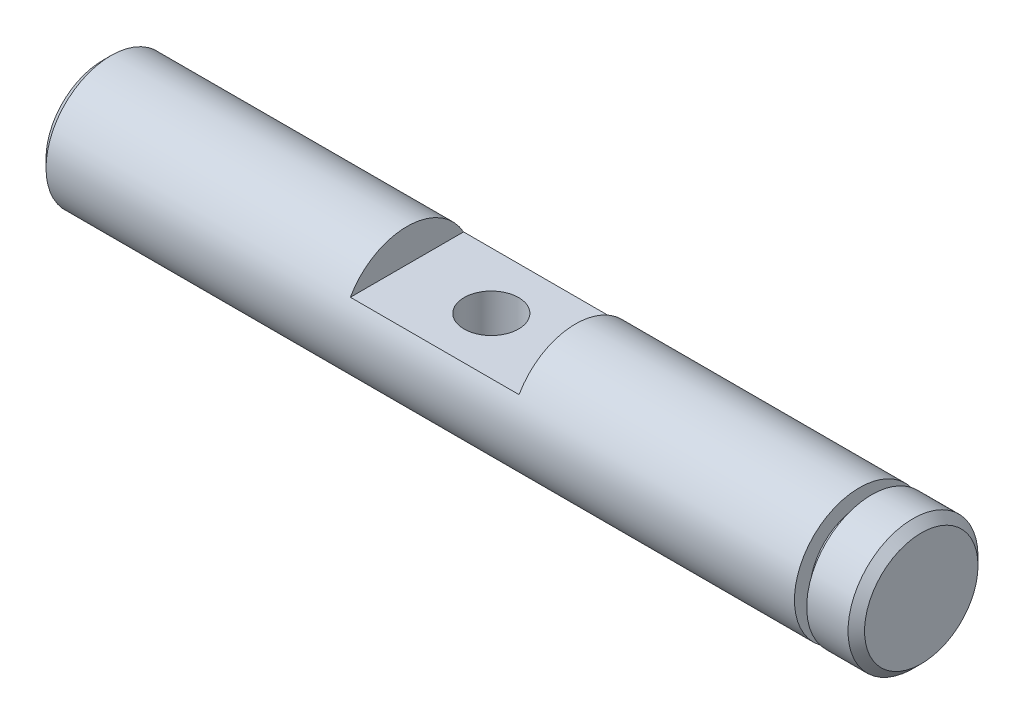
ISO-10303-21;
HEADER;
FILE_DESCRIPTION(('STEP AP214'),'2;1');
FILE_NAME('part.step','',(''),(''),'','','');
FILE_SCHEMA(('AUTOMOTIVE_DESIGN { 1 0 10303 214 1 1 1 1 }'));
ENDSEC;
DATA;
#1=APPLICATION_CONTEXT('core data for automotive mechanical design processes');
#2=APPLICATION_PROTOCOL_DEFINITION('international standard','automotive_design',2000,#1);
#3=PRODUCT_CONTEXT('',#1,'mechanical');
#4=PRODUCT('Part','Part','',(#3));
#5=PRODUCT_RELATED_PRODUCT_CATEGORY('part','',(#4));
#6=PRODUCT_DEFINITION_FORMATION('','',#4);
#7=PRODUCT_DEFINITION_CONTEXT('part definition',#1,'design');
#8=PRODUCT_DEFINITION('design','',#6,#7);
#9=PRODUCT_DEFINITION_SHAPE('','',#8);
#10=(LENGTH_UNIT() NAMED_UNIT(*) SI_UNIT(.MILLI.,.METRE.));
#11=(NAMED_UNIT(*) PLANE_ANGLE_UNIT() SI_UNIT($,.RADIAN.));
#12=(NAMED_UNIT(*) SI_UNIT($,.STERADIAN.) SOLID_ANGLE_UNIT());
#13=UNCERTAINTY_MEASURE_WITH_UNIT(LENGTH_MEASURE(1.E-05),#10,'distance_accuracy_value','');
#14=(GEOMETRIC_REPRESENTATION_CONTEXT(3) GLOBAL_UNCERTAINTY_ASSIGNED_CONTEXT((#13)) GLOBAL_UNIT_ASSIGNED_CONTEXT((#10,
#11,#12)) REPRESENTATION_CONTEXT('',''));
#15=CARTESIAN_POINT('',(0.,0.,0.));
#16=DIRECTION('',(0.,0.,1.));
#17=DIRECTION('',(1.,0.,0.));
#18=AXIS2_PLACEMENT_3D('',#15,#16,#17);
#19=CARTESIAN_POINT('',(-20.9,1.93,-3.42344855372474));
#20=DIRECTION('',(0.,-1.,0.));
#21=DIRECTION('',(0.,0.,-1.));
#22=AXIS2_PLACEMENT_3D('',#19,#20,#21);
#23=PLANE('',#22);
#24=DIRECTION('',(0.,0.,1.));
#25=VECTOR('',#24,1.);
#26=CARTESIAN_POINT('',(-31.1,1.93,-3.42344855372474));
#27=LINE('',#26,#25);
#28=CARTESIAN_POINT('',(-31.1,1.93,-3.42344855372474));
#29=VERTEX_POINT('',#28);
#30=CARTESIAN_POINT('',(-31.1,1.93,3.42344855372474));
#31=VERTEX_POINT('',#30);
#32=EDGE_CURVE('E72',#29,#31,#27,.T.);
#33=ORIENTED_EDGE('',*,*,#32,.T.);
#34=DIRECTION('',(-1.,0.,0.));
#35=VECTOR('',#34,1.);
#36=CARTESIAN_POINT('',(-20.9,1.93,3.42344855372474));
#37=LINE('',#36,#35);
#38=CARTESIAN_POINT('',(-20.9,1.93,3.42344855372474));
#39=VERTEX_POINT('',#38);
#40=EDGE_CURVE('E80',#39,#31,#37,.T.);
#41=ORIENTED_EDGE('',*,*,#40,.F.);
#42=DIRECTION('',(0.,0.,1.));
#43=VECTOR('',#42,1.);
#44=CARTESIAN_POINT('',(-20.9,1.93,-3.42344855372474));
#45=LINE('',#44,#43);
#46=CARTESIAN_POINT('',(-20.9,1.93,-3.42344855372474));
#47=VERTEX_POINT('',#46);
#48=EDGE_CURVE('E108',#47,#39,#45,.T.);
#49=ORIENTED_EDGE('',*,*,#48,.F.);
#50=DIRECTION('',(-1.,0.,0.));
#51=VECTOR('',#50,1.);
#52=CARTESIAN_POINT('',(-20.9,1.93,-3.42344855372474));
#53=LINE('',#52,#51);
#54=EDGE_CURVE('E94',#47,#29,#53,.T.);
#55=ORIENTED_EDGE('',*,*,#54,.T.);
#56=EDGE_LOOP('',(#33,#41,#49,#55));
#57=FACE_BOUND('',#56,.T.);
#58=CARTESIAN_POINT('',(-26.,1.93,0.));
#59=DIRECTION('',(0.,1.,0.));
#60=DIRECTION('',(0.,0.,1.));
#61=AXIS2_PLACEMENT_3D('',#58,#59,#60);
#62=CIRCLE('',#61,1.65);
#63=CARTESIAN_POINT('',(-26.,1.93,1.65));
#64=VERTEX_POINT('',#63);
#65=EDGE_CURVE('E91',#64,#64,#62,.T.);
#66=ORIENTED_EDGE('',*,*,#65,.F.);
#67=EDGE_LOOP('',(#66));
#68=FACE_BOUND('',#67,.T.);
#69=ADVANCED_FACE('F51',(#57,#68),#23,.F.);
#70=CARTESIAN_POINT('',(0.,0.,0.));
#71=DIRECTION('',(1.,0.,0.));
#72=DIRECTION('',(0.,0.,-1.));
#73=AXIS2_PLACEMENT_3D('',#70,#71,#72);
#74=CYLINDRICAL_SURFACE('',#73,3.93);
#75=CARTESIAN_POINT('',(-24.35,-3.93,0.));
#76=CARTESIAN_POINT('',(-24.3500097101932,-3.9299926789985,0.0883269978215212));
#77=CARTESIAN_POINT('',(-24.3571343884214,-3.92698785604896,0.176789915546049));
#78=CARTESIAN_POINT('',(-24.3853787578915,-3.91525803732159,0.351205886288125));
#79=CARTESIAN_POINT('',(-24.4065346601639,-3.90651824165485,0.437151842841555));
#80=CARTESIAN_POINT('',(-24.4619197374349,-3.88425693415309,0.603723872787699));
#81=CARTESIAN_POINT('',(-24.4961043490442,-3.8707517334591,0.684366993554734));
#82=CARTESIAN_POINT('',(-24.576391122907,-3.84027172391907,0.838694802432977));
#83=CARTESIAN_POINT('',(-24.6224897767889,-3.82329793678784,0.912381530312186));
#84=CARTESIAN_POINT('',(-24.7277692568294,-3.78661154798099,1.05456760218472));
#85=CARTESIAN_POINT('',(-24.7874581855707,-3.76680836449226,1.1226671446446));
#86=CARTESIAN_POINT('',(-24.9171491312657,-3.72708432042744,1.24823404181553));
#87=CARTESIAN_POINT('',(-24.9871566199691,-3.7071634028323,1.30569571875639));
#88=CARTESIAN_POINT('',(-25.1397506665203,-3.66834093740185,1.41120395193725));
#89=CARTESIAN_POINT('',(-25.2227919089502,-3.64954056620032,1.4586340554539));
#90=CARTESIAN_POINT('',(-25.3965769421471,-3.61652730746775,1.53867434421455));
#91=CARTESIAN_POINT('',(-25.4873166753707,-3.60231202207438,1.5712922794308));
#92=CARTESIAN_POINT('',(-25.6693207401283,-3.58106037708631,1.61912491660325));
#93=CARTESIAN_POINT('',(-25.7603443567938,-3.57370814255634,1.63510973623413));
#94=CARTESIAN_POINT('',(-25.9440558589965,-3.56610832640151,1.65162432352032));
#95=CARTESIAN_POINT('',(-26.0367427768981,-3.56585673995529,1.65216280303577));
#96=CARTESIAN_POINT('',(-26.2134239906545,-3.57221973457656,1.63834882101229));
#97=CARTESIAN_POINT('',(-26.297532052281,-3.57829986945526,1.62515547854183));
#98=CARTESIAN_POINT('',(-26.4622068151594,-3.59573687169694,1.58619888596701));
#99=CARTESIAN_POINT('',(-26.5427728225678,-3.60709476790936,1.56043318495171));
#100=CARTESIAN_POINT('',(-26.7001271330675,-3.63406515923432,1.49655930938434));
#101=CARTESIAN_POINT('',(-26.776797464085,-3.64976362286058,1.45819844299294));
#102=CARTESIAN_POINT('',(-26.922913953025,-3.68362705904633,1.37040211265534));
#103=CARTESIAN_POINT('',(-26.9923572215252,-3.7017930114824,1.32096224397827));
#104=CARTESIAN_POINT('',(-27.1283291596033,-3.74044328708086,1.20742501261697));
#105=CARTESIAN_POINT('',(-27.1940945826481,-3.76099268954806,1.14243318194895));
#106=CARTESIAN_POINT('',(-27.3140511528564,-3.80077926076808,1.00214252669914));
#107=CARTESIAN_POINT('',(-27.3682395057146,-3.82001611195542,0.92684122094581));
#108=CARTESIAN_POINT('',(-27.4646464834446,-3.85558430243719,0.765719425568003));
#109=CARTESIAN_POINT('',(-27.5065500990819,-3.87183574234339,0.679691502376429));
#110=CARTESIAN_POINT('',(-27.5750215903072,-3.89898687097859,0.500950669168409));
#111=CARTESIAN_POINT('',(-27.6015980748126,-3.90988956346815,0.408241544823623));
#112=CARTESIAN_POINT('',(-27.6370528647678,-3.92455097291784,0.225144446145694));
#113=CARTESIAN_POINT('',(-27.6469551772896,-3.92872231961856,0.134987775583984));
#114=CARTESIAN_POINT('',(-27.6518390674538,-3.93077152354498,-0.0457883680487249));
#115=CARTESIAN_POINT('',(-27.6468250126539,-3.92865122298452,-0.136407697895148));
#116=CARTESIAN_POINT('',(-27.6227475379895,-3.91862242611764,-0.310711318354062));
#117=CARTESIAN_POINT('',(-27.6044072081616,-3.91101197501458,-0.394514602822413));
#118=CARTESIAN_POINT('',(-27.5552085648342,-3.89108850075683,-0.557760655629197));
#119=CARTESIAN_POINT('',(-27.5243486758726,-3.87877488576714,-0.637202873741838));
#120=CARTESIAN_POINT('',(-27.4499799672681,-3.85014676700823,-0.792264236302527));
#121=CARTESIAN_POINT('',(-27.4061073724435,-3.8337196726585,-0.867687448585519));
#122=CARTESIAN_POINT('',(-27.3073577987871,-3.79861242424103,-1.01037186093844));
#123=CARTESIAN_POINT('',(-27.2524761954979,-3.77993132467174,-1.0776296118924));
#124=CARTESIAN_POINT('',(-27.1286128441927,-3.7406516701824,-1.20720168853093));
#125=CARTESIAN_POINT('',(-27.0588972429186,-3.72001230055169,-1.26880393872402));
#126=CARTESIAN_POINT('',(-26.9097962899649,-3.68034946321322,-1.37963820227883));
#127=CARTESIAN_POINT('',(-26.8304086225766,-3.66132638433934,-1.42886724454268));
#128=CARTESIAN_POINT('',(-26.6624871349754,-3.62690637045008,-1.51413531819438));
#129=CARTESIAN_POINT('',(-26.5738326651811,-3.61156892904637,-1.54996255344417));
#130=CARTESIAN_POINT('',(-26.3909017963839,-3.58706375522705,-1.60587132157007));
#131=CARTESIAN_POINT('',(-26.2966302012383,-3.57789083097617,-1.62596610687657));
#132=CARTESIAN_POINT('',(-26.113054925141,-3.56755440896531,-1.64851303555964));
#133=CARTESIAN_POINT('',(-26.0239364268509,-3.56582257121674,-1.6522177533318));
#134=CARTESIAN_POINT('',(-25.8463980757674,-3.56905045777433,-1.64523381719311));
#135=CARTESIAN_POINT('',(-25.7579781139573,-3.57400911631949,-1.6345474557063));
#136=CARTESIAN_POINT('',(-25.5887226906317,-3.58953642652886,-1.6001422245184));
#137=CARTESIAN_POINT('',(-25.5077268801888,-3.59982445809366,-1.57707334181445));
#138=CARTESIAN_POINT('',(-25.3507396722111,-3.62462698186077,-1.51919883462504));
#139=CARTESIAN_POINT('',(-25.2747496925365,-3.63914266525289,-1.48438990180726));
#140=CARTESIAN_POINT('',(-25.1248999668214,-3.67185602056917,-1.40159421388986));
#141=CARTESIAN_POINT('',(-25.0514488097631,-3.69022358777055,-1.35293637075636));
#142=CARTESIAN_POINT('',(-24.9133622528258,-3.72810466091352,-1.24475606537435));
#143=CARTESIAN_POINT('',(-24.8487299987934,-3.74761857224232,-1.18522974377432));
#144=CARTESIAN_POINT('',(-24.7251645738068,-3.78733792055977,-1.05174467300407));
#145=CARTESIAN_POINT('',(-24.6670135834902,-3.80748673187844,-0.977041503100169));
#146=CARTESIAN_POINT('',(-24.5640281644525,-3.84475018287915,-0.818193911428492));
#147=CARTESIAN_POINT('',(-24.5191997907634,-3.86186344150453,-0.734045220603839));
#148=CARTESIAN_POINT('',(-24.4450824205554,-3.89088976229158,-0.559948483167666));
#149=CARTESIAN_POINT('',(-24.4155556136396,-3.90288186312324,-0.470115163768419));
#150=CARTESIAN_POINT('',(-24.3723073743874,-3.92063552175965,-0.286308061885108));
#151=CARTESIAN_POINT('',(-24.3585365917179,-3.92641653018921,-0.192348169964576));
#152=CARTESIAN_POINT('',(-24.3509673585932,-3.92959484738707,-0.0653603659641922));
#153=CARTESIAN_POINT('',(-24.3499964062938,-3.93000270947527,-0.0326894915410315));
#154=CARTESIAN_POINT('',(-24.35,-3.93,0.));
#155=B_SPLINE_CURVE_WITH_KNOTS('',3,(#75,#76,#77,#78,#79,#80,#81,#82,#83,#84,#85,#86,#87,#88,
#89,#90,#91,#92,#93,#94,#95,#96,#97,#98,#99,#100,#101,#102,#103,#104,#105,#106,#107,#108,#109,
#110,#111,#112,#113,#114,#115,#116,#117,#118,#119,#120,#121,#122,#123,#124,#125,#126,#127,#128,
#129,#130,#131,#132,#133,#134,#135,#136,#137,#138,#139,#140,#141,#142,#143,#144,#145,#146,#147,
#148,#149,#150,#151,#152,#153,#154),.UNSPECIFIED.,.T.,.F.,(4,2,2,2,2,2,2,2,2,2,2,2,2,2,2,2,2,2,
2,2,2,2,2,2,2,2,2,2,2,2,2,2,2,2,2,2,2,2,2,4),(0.,0.264886893383162,0.530460066607243,
0.795132909216566,1.05972790127276,1.33661027141791,1.61363999917676,1.90455851513283,
2.19532464181942,2.47193168760119,2.74838272171372,3.00325373864307,3.25817446111333,
3.51855871078965,3.77904666689947,4.06191885111166,4.34485923396919,4.63452261364791,
4.92402313682995,5.19499196337771,5.4658814572412,5.72307595736119,5.98030283289553,
6.24553525267182,6.5108793204878,6.79546360656313,7.08011616286466,7.36909416064038,
7.65782847140854,7.92406727577222,8.19026367469623,8.44368633456517,8.69718046839307,
8.96604605154444,9.23500729408639,9.52398638289448,9.81309661043573,10.0975676174597,
10.3811451564272,10.4791788049622),.UNSPECIFIED.);
#156=CARTESIAN_POINT('',(-24.35,-3.93,0.));
#157=VERTEX_POINT('',#156);
#158=EDGE_CURVE('E11',#157,#157,#155,.T.);
#159=ORIENTED_EDGE('',*,*,#158,.F.);
#160=EDGE_LOOP('',(#159));
#161=FACE_BOUND('',#160,.T.);
#162=CARTESIAN_POINT('',(-49.,0.,0.));
#163=DIRECTION('',(-1.,0.,0.));
#164=DIRECTION('',(0.,0.,1.));
#165=AXIS2_PLACEMENT_3D('',#162,#163,#164);
#166=CIRCLE('',#165,3.93);
#167=CARTESIAN_POINT('',(-49.,0.,3.93));
#168=VERTEX_POINT('',#167);
#169=EDGE_CURVE('E122',#168,#168,#166,.F.);
#170=ORIENTED_EDGE('',*,*,#169,.T.);
#171=EDGE_LOOP('',(#170));
#172=FACE_BOUND('',#171,.T.);
#173=CARTESIAN_POINT('',(-3.74,0.,0.));
#174=DIRECTION('',(1.,0.,0.));
#175=DIRECTION('',(0.,0.,-1.));
#176=AXIS2_PLACEMENT_3D('',#173,#174,#175);
#177=CIRCLE('',#176,3.93);
#178=CARTESIAN_POINT('',(-3.74,0.,-3.93));
#179=VERTEX_POINT('',#178);
#180=EDGE_CURVE('E101',#179,#179,#177,.T.);
#181=ORIENTED_EDGE('',*,*,#180,.F.);
#182=EDGE_LOOP('',(#181));
#183=FACE_BOUND('',#182,.T.);
#184=ORIENTED_EDGE('',*,*,#54,.F.);
#185=CARTESIAN_POINT('',(-20.9,0.,0.));
#186=DIRECTION('',(-1.,0.,0.));
#187=DIRECTION('',(0.,0.,1.));
#188=AXIS2_PLACEMENT_3D('',#185,#186,#187);
#189=CIRCLE('',#188,3.93);
#190=EDGE_CURVE('E96',#39,#47,#189,.T.);
#191=ORIENTED_EDGE('',*,*,#190,.F.);
#192=ORIENTED_EDGE('',*,*,#40,.T.);
#193=CARTESIAN_POINT('',(-31.1,0.,0.));
#194=DIRECTION('',(-1.,0.,0.));
#195=DIRECTION('',(0.,0.,1.));
#196=AXIS2_PLACEMENT_3D('',#193,#194,#195);
#197=CIRCLE('',#196,3.93);
#198=EDGE_CURVE('E86',#31,#29,#197,.T.);
#199=ORIENTED_EDGE('',*,*,#198,.T.);
#200=EDGE_LOOP('',(#184,#191,#192,#199));
#201=FACE_BOUND('',#200,.T.);
#202=ADVANCED_FACE('F99',(#161,#172,#183,#201),#74,.T.);
#203=CARTESIAN_POINT('',(0.,0.,0.));
#204=DIRECTION('',(1.,0.,0.));
#205=DIRECTION('',(0.,0.,-1.));
#206=AXIS2_PLACEMENT_3D('',#203,#204,#205);
#207=PLANE('',#206);
#208=CARTESIAN_POINT('',(0.,0.,0.));
#209=DIRECTION('',(1.,0.,0.));
#210=DIRECTION('',(0.,0.,-1.));
#211=AXIS2_PLACEMENT_3D('',#208,#209,#210);
#212=CIRCLE('',#211,3.43);
#213=CARTESIAN_POINT('',(0.,0.,-3.43));
#214=VERTEX_POINT('',#213);
#215=EDGE_CURVE('E130',#214,#214,#212,.T.);
#216=ORIENTED_EDGE('',*,*,#215,.T.);
#217=EDGE_LOOP('',(#216));
#218=FACE_BOUND('',#217,.T.);
#219=ADVANCED_FACE('F146',(#218),#207,.T.);
#220=CARTESIAN_POINT('',(0.,0.,0.));
#221=DIRECTION('',(1.,0.,0.));
#222=DIRECTION('',(0.,0.,-1.));
#223=AXIS2_PLACEMENT_3D('',#220,#221,#222);
#224=CYLINDRICAL_SURFACE('',#223,3.93);
#225=CARTESIAN_POINT('',(-0.500000000000004,0.,0.));
#226=DIRECTION('',(1.,0.,0.));
#227=DIRECTION('',(0.,0.,-1.));
#228=AXIS2_PLACEMENT_3D('',#225,#226,#227);
#229=CIRCLE('',#228,3.93);
#230=CARTESIAN_POINT('',(-0.500000000000004,0.,-3.93));
#231=VERTEX_POINT('',#230);
#232=EDGE_CURVE('E66',#231,#231,#229,.F.);
#233=ORIENTED_EDGE('',*,*,#232,.T.);
#234=EDGE_LOOP('',(#233));
#235=FACE_BOUND('',#234,.T.);
#236=CARTESIAN_POINT('',(-3.,0.,0.));
#237=DIRECTION('',(1.,0.,0.));
#238=DIRECTION('',(0.,0.,-1.));
#239=AXIS2_PLACEMENT_3D('',#236,#237,#238);
#240=CIRCLE('',#239,3.93);
#241=CARTESIAN_POINT('',(-3.,0.,-3.93));
#242=VERTEX_POINT('',#241);
#243=EDGE_CURVE('E118',#242,#242,#240,.T.);
#244=ORIENTED_EDGE('',*,*,#243,.T.);
#245=EDGE_LOOP('',(#244));
#246=FACE_BOUND('',#245,.T.);
#247=ADVANCED_FACE('F137',(#235,#246),#224,.T.);
#248=CARTESIAN_POINT('',(-3.,3.93,0.));
#249=DIRECTION('',(-1.,0.,0.));
#250=DIRECTION('',(0.,0.,1.));
#251=AXIS2_PLACEMENT_3D('',#248,#249,#250);
#252=PLANE('',#251);
#253=CARTESIAN_POINT('',(-3.,0.,0.));
#254=DIRECTION('',(1.,0.,0.));
#255=DIRECTION('',(0.,0.,-1.));
#256=AXIS2_PLACEMENT_3D('',#253,#254,#255);
#257=CIRCLE('',#256,3.);
#258=CARTESIAN_POINT('',(-3.,0.,-3.));
#259=VERTEX_POINT('',#258);
#260=EDGE_CURVE('E114',#259,#259,#257,.T.);
#261=ORIENTED_EDGE('',*,*,#260,.T.);
#262=EDGE_LOOP('',(#261));
#263=FACE_BOUND('',#262,.T.);
#264=ORIENTED_EDGE('',*,*,#243,.F.);
#265=EDGE_LOOP('',(#264));
#266=FACE_BOUND('',#265,.T.);
#267=ADVANCED_FACE('F153',(#263,#266),#252,.T.);
#268=CARTESIAN_POINT('',(0.,0.,0.));
#269=DIRECTION('',(1.,0.,0.));
#270=DIRECTION('',(0.,0.,-1.));
#271=AXIS2_PLACEMENT_3D('',#268,#269,#270);
#272=CYLINDRICAL_SURFACE('',#271,3.);
#273=CARTESIAN_POINT('',(-3.74,0.,0.));
#274=DIRECTION('',(1.,0.,0.));
#275=DIRECTION('',(0.,0.,-1.));
#276=AXIS2_PLACEMENT_3D('',#273,#274,#275);
#277=CIRCLE('',#276,3.);
#278=CARTESIAN_POINT('',(-3.74,0.,-3.));
#279=VERTEX_POINT('',#278);
#280=EDGE_CURVE('E106',#279,#279,#277,.T.);
#281=ORIENTED_EDGE('',*,*,#280,.T.);
#282=EDGE_LOOP('',(#281));
#283=FACE_BOUND('',#282,.T.);
#284=ORIENTED_EDGE('',*,*,#260,.F.);
#285=EDGE_LOOP('',(#284));
#286=FACE_BOUND('',#285,.T.);
#287=ADVANCED_FACE('F172',(#283,#286),#272,.T.);
#288=CARTESIAN_POINT('',(-3.74,3.,0.));
#289=DIRECTION('',(1.,0.,0.));
#290=DIRECTION('',(0.,0.,-1.));
#291=AXIS2_PLACEMENT_3D('',#288,#289,#290);
#292=PLANE('',#291);
#293=ORIENTED_EDGE('',*,*,#180,.T.);
#294=EDGE_LOOP('',(#293));
#295=FACE_BOUND('',#294,.T.);
#296=ORIENTED_EDGE('',*,*,#280,.F.);
#297=EDGE_LOOP('',(#296));
#298=FACE_BOUND('',#297,.T.);
#299=ADVANCED_FACE('F167',(#295,#298),#292,.T.);
#300=CARTESIAN_POINT('',(-49.5,3.93,0.));
#301=DIRECTION('',(-1.,0.,0.));
#302=DIRECTION('',(0.,0.,1.));
#303=AXIS2_PLACEMENT_3D('',#300,#301,#302);
#304=PLANE('',#303);
#305=CARTESIAN_POINT('',(-49.5,0.,0.));
#306=DIRECTION('',(-1.,0.,0.));
#307=DIRECTION('',(0.,0.,1.));
#308=AXIS2_PLACEMENT_3D('',#305,#306,#307);
#309=CIRCLE('',#308,3.43);
#310=CARTESIAN_POINT('',(-49.5,0.,3.43));
#311=VERTEX_POINT('',#310);
#312=EDGE_CURVE('E126',#311,#311,#309,.T.);
#313=ORIENTED_EDGE('',*,*,#312,.T.);
#314=EDGE_LOOP('',(#313));
#315=FACE_BOUND('',#314,.T.);
#316=ADVANCED_FACE('F165',(#315),#304,.T.);
#317=CARTESIAN_POINT('',(-49.,0.,0.));
#318=DIRECTION('',(1.,0.,0.));
#319=DIRECTION('',(0.,0.,-1.));
#320=AXIS2_PLACEMENT_3D('',#317,#318,#319);
#321=CONICAL_SURFACE('',#320,3.93,0.785398163397453);
#322=ORIENTED_EDGE('',*,*,#312,.F.);
#323=EDGE_LOOP('',(#322));
#324=FACE_BOUND('',#323,.T.);
#325=ORIENTED_EDGE('',*,*,#169,.F.);
#326=EDGE_LOOP('',(#325));
#327=FACE_BOUND('',#326,.T.);
#328=ADVANCED_FACE('F143',(#324,#327),#321,.T.);
#329=CARTESIAN_POINT('',(0.,0.,0.));
#330=DIRECTION('',(-1.,0.,0.));
#331=DIRECTION('',(0.,0.,1.));
#332=AXIS2_PLACEMENT_3D('',#329,#330,#331);
#333=CONICAL_SURFACE('',#332,3.43,0.785398163397449);
#334=ORIENTED_EDGE('',*,*,#232,.F.);
#335=EDGE_LOOP('',(#334));
#336=FACE_BOUND('',#335,.T.);
#337=ORIENTED_EDGE('',*,*,#215,.F.);
#338=EDGE_LOOP('',(#337));
#339=FACE_BOUND('',#338,.T.);
#340=ADVANCED_FACE('F54',(#336,#339),#333,.T.);
#341=CARTESIAN_POINT('',(-20.9,0.,0.));
#342=DIRECTION('',(-1.,0.,0.));
#343=DIRECTION('',(0.,0.,1.));
#344=AXIS2_PLACEMENT_3D('',#341,#342,#343);
#345=PLANE('',#344);
#346=ORIENTED_EDGE('',*,*,#190,.T.);
#347=ORIENTED_EDGE('',*,*,#48,.T.);
#348=EDGE_LOOP('',(#346,#347));
#349=FACE_BOUND('',#348,.T.);
#350=ADVANCED_FACE('F142',(#349),#345,.T.);
#351=CARTESIAN_POINT('',(-31.1,0.,0.));
#352=DIRECTION('',(-1.,0.,0.));
#353=DIRECTION('',(0.,0.,1.));
#354=AXIS2_PLACEMENT_3D('',#351,#352,#353);
#355=PLANE('',#354);
#356=ORIENTED_EDGE('',*,*,#198,.F.);
#357=ORIENTED_EDGE('',*,*,#32,.F.);
#358=EDGE_LOOP('',(#356,#357));
#359=FACE_BOUND('',#358,.T.);
#360=ADVANCED_FACE('F87',(#359),#355,.F.);
#361=CARTESIAN_POINT('',(-26.,1.93,0.));
#362=DIRECTION('',(0.,1.,0.));
#363=DIRECTION('',(0.,0.,1.));
#364=AXIS2_PLACEMENT_3D('',#361,#362,#363);
#365=CYLINDRICAL_SURFACE('',#364,1.65);
#366=ORIENTED_EDGE('',*,*,#158,.T.);
#367=EDGE_LOOP('',(#366));
#368=FACE_BOUND('',#367,.T.);
#369=ORIENTED_EDGE('',*,*,#65,.T.);
#370=EDGE_LOOP('',(#369));
#371=FACE_BOUND('',#370,.T.);
#372=ADVANCED_FACE('F239',(#368,#371),#365,.F.);
#373=CLOSED_SHELL('',(#69,#202,#219,#247,#267,#287,#299,#316,#328,#340,#350,#360,#372));
#374=MANIFOLD_SOLID_BREP('B2',#373);
#375=ADVANCED_BREP_SHAPE_REPRESENTATION('',(#18,#374),#14);
#376=SHAPE_DEFINITION_REPRESENTATION(#9,#375);
ENDSEC;
END-ISO-10303-21;
